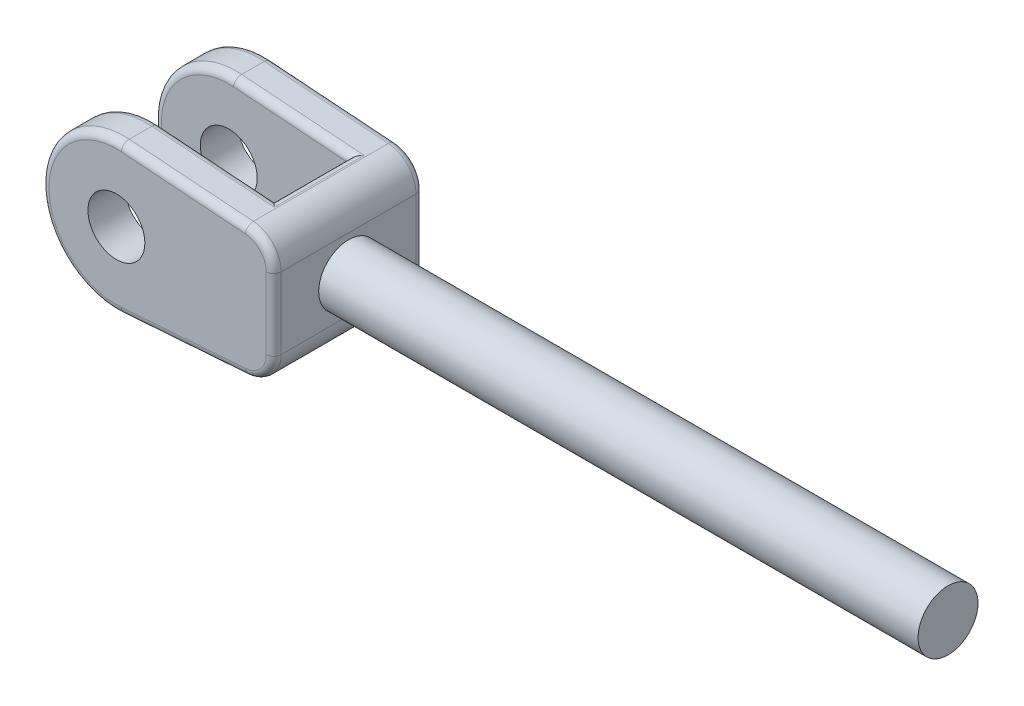
ISO-10303-21;
HEADER;
FILE_DESCRIPTION(('STEP AP214'),'2;1');
FILE_NAME('part.step','',(''),(''),'','','');
FILE_SCHEMA(('AUTOMOTIVE_DESIGN { 1 0 10303 214 1 1 1 1 }'));
ENDSEC;
DATA;
#1=APPLICATION_CONTEXT('core data for automotive mechanical design processes');
#2=APPLICATION_PROTOCOL_DEFINITION('international standard','automotive_design',2000,#1);
#3=PRODUCT_CONTEXT('',#1,'mechanical');
#4=PRODUCT('Part','Part','',(#3));
#5=PRODUCT_RELATED_PRODUCT_CATEGORY('part','',(#4));
#6=PRODUCT_DEFINITION_FORMATION('','',#4);
#7=PRODUCT_DEFINITION_CONTEXT('part definition',#1,'design');
#8=PRODUCT_DEFINITION('design','',#6,#7);
#9=PRODUCT_DEFINITION_SHAPE('','',#8);
#10=(LENGTH_UNIT() NAMED_UNIT(*) SI_UNIT(.MILLI.,.METRE.));
#11=(NAMED_UNIT(*) PLANE_ANGLE_UNIT() SI_UNIT($,.RADIAN.));
#12=(NAMED_UNIT(*) SI_UNIT($,.STERADIAN.) SOLID_ANGLE_UNIT());
#13=UNCERTAINTY_MEASURE_WITH_UNIT(LENGTH_MEASURE(1.E-05),#10,'distance_accuracy_value','');
#14=(GEOMETRIC_REPRESENTATION_CONTEXT(3) GLOBAL_UNCERTAINTY_ASSIGNED_CONTEXT((#13)) GLOBAL_UNIT_ASSIGNED_CONTEXT((#10,
#11,#12)) REPRESENTATION_CONTEXT('',''));
#15=CARTESIAN_POINT('',(0.,0.,0.));
#16=DIRECTION('',(0.,0.,1.));
#17=DIRECTION('',(1.,0.,0.));
#18=AXIS2_PLACEMENT_3D('',#15,#16,#17);
#19=CARTESIAN_POINT('',(-5.25,0.,2.5));
#20=DIRECTION('',(0.,0.,-1.));
#21=DIRECTION('',(-1.,0.,0.));
#22=AXIS2_PLACEMENT_3D('',#19,#20,#21);
#23=CYLINDRICAL_SURFACE('',#22,2.5);
#24=DIRECTION('',(0.,0.,-1.));
#25=VECTOR('',#24,1.);
#26=CARTESIAN_POINT('',(-5.06876612994241,2.49342220338713,2.5));
#27=LINE('',#26,#25);
#28=CARTESIAN_POINT('',(-5.06876612994241,2.49342220338713,2.25));
#29=VERTEX_POINT('',#28);
#30=CARTESIAN_POINT('',(-5.06876612994241,2.49342220338713,1.5));
#31=VERTEX_POINT('',#30);
#32=EDGE_CURVE('E195',#29,#31,#27,.T.);
#33=ORIENTED_EDGE('',*,*,#32,.T.);
#34=CARTESIAN_POINT('',(-5.25,0.,1.5));
#35=DIRECTION('',(0.,0.,1.));
#36=DIRECTION('',(1.,0.,0.));
#37=AXIS2_PLACEMENT_3D('',#34,#35,#36);
#38=CIRCLE('',#37,2.5);
#39=CARTESIAN_POINT('',(-5.06876612994241,-2.49342220338713,1.5));
#40=VERTEX_POINT('',#39);
#41=EDGE_CURVE('E338',#31,#40,#38,.T.);
#42=ORIENTED_EDGE('',*,*,#41,.T.);
#43=DIRECTION('',(0.,0.,-1.));
#44=VECTOR('',#43,1.);
#45=CARTESIAN_POINT('',(-5.06876612994241,-2.49342220338713,2.5));
#46=LINE('',#45,#44);
#47=CARTESIAN_POINT('',(-5.06876612994241,-2.49342220338713,2.25));
#48=VERTEX_POINT('',#47);
#49=EDGE_CURVE('E378',#48,#40,#46,.T.);
#50=ORIENTED_EDGE('',*,*,#49,.F.);
#51=CARTESIAN_POINT('',(-5.25,0.,2.25));
#52=DIRECTION('',(0.,0.,1.));
#53=DIRECTION('',(1.,0.,0.));
#54=AXIS2_PLACEMENT_3D('',#51,#52,#53);
#55=CIRCLE('',#54,2.5);
#56=EDGE_CURVE('E340',#48,#29,#55,.F.);
#57=ORIENTED_EDGE('',*,*,#56,.T.);
#58=EDGE_LOOP('',(#33,#42,#50,#57));
#59=FACE_BOUND('',#58,.T.);
#60=ADVANCED_FACE('F35',(#59),#23,.T.);
#61=CARTESIAN_POINT('',(-5.25,0.,2.5));
#62=DIRECTION('',(0.,0.,-1.));
#63=DIRECTION('',(-1.,0.,0.));
#64=AXIS2_PLACEMENT_3D('',#61,#62,#63);
#65=CYLINDRICAL_SURFACE('',#64,0.95);
#66=CARTESIAN_POINT('',(-5.25,0.,-1.25));
#67=DIRECTION('',(0.,0.,-1.));
#68=DIRECTION('',(-1.,0.,0.));
#69=AXIS2_PLACEMENT_3D('',#66,#67,#68);
#70=CIRCLE('',#69,0.95);
#71=CARTESIAN_POINT('',(-6.2,0.,-1.25));
#72=VERTEX_POINT('',#71);
#73=EDGE_CURVE('E360',#72,#72,#70,.T.);
#74=ORIENTED_EDGE('',*,*,#73,.F.);
#75=EDGE_LOOP('',(#74));
#76=FACE_BOUND('',#75,.T.);
#77=CARTESIAN_POINT('',(-5.25,0.,-2.5));
#78=DIRECTION('',(0.,0.,1.));
#79=DIRECTION('',(1.,0.,0.));
#80=AXIS2_PLACEMENT_3D('',#77,#78,#79);
#81=CIRCLE('',#80,0.95);
#82=CARTESIAN_POINT('',(-4.3,0.,-2.5));
#83=VERTEX_POINT('',#82);
#84=EDGE_CURVE('E363',#83,#83,#81,.T.);
#85=ORIENTED_EDGE('',*,*,#84,.F.);
#86=EDGE_LOOP('',(#85));
#87=FACE_BOUND('',#86,.T.);
#88=ADVANCED_FACE('F497',(#76,#87),#65,.F.);
#89=CARTESIAN_POINT('',(20.,0.,0.));
#90=DIRECTION('',(-1.,0.,0.));
#91=DIRECTION('',(0.,0.,1.));
#92=AXIS2_PLACEMENT_3D('',#89,#90,#91);
#93=CYLINDRICAL_SURFACE('',#92,1.);
#94=CARTESIAN_POINT('',(20.,0.,0.));
#95=DIRECTION('',(1.,0.,0.));
#96=DIRECTION('',(0.,0.,-1.));
#97=AXIS2_PLACEMENT_3D('',#94,#95,#96);
#98=CIRCLE('',#97,1.);
#99=CARTESIAN_POINT('',(20.,0.,-1.));
#100=VERTEX_POINT('',#99);
#101=EDGE_CURVE('E212',#100,#100,#98,.T.);
#102=ORIENTED_EDGE('',*,*,#101,.F.);
#103=EDGE_LOOP('',(#102));
#104=FACE_BOUND('',#103,.T.);
#105=CARTESIAN_POINT('',(0.,0.,0.));
#106=DIRECTION('',(-1.,0.,0.));
#107=DIRECTION('',(0.,-1.,0.));
#108=AXIS2_PLACEMENT_3D('',#105,#106,#107);
#109=CIRCLE('',#108,1.);
#110=CARTESIAN_POINT('',(0.,-1.,0.));
#111=VERTEX_POINT('',#110);
#112=EDGE_CURVE('E370',#111,#111,#109,.T.);
#113=ORIENTED_EDGE('',*,*,#112,.F.);
#114=EDGE_LOOP('',(#113));
#115=FACE_BOUND('',#114,.T.);
#116=ADVANCED_FACE('F503',(#104,#115),#93,.T.);
#117=CARTESIAN_POINT('',(20.,0.,0.));
#118=DIRECTION('',(1.,0.,0.));
#119=DIRECTION('',(0.,0.,-1.));
#120=AXIS2_PLACEMENT_3D('',#117,#118,#119);
#121=PLANE('',#120);
#122=ORIENTED_EDGE('',*,*,#101,.T.);
#123=EDGE_LOOP('',(#122));
#124=FACE_BOUND('',#123,.T.);
#125=ADVANCED_FACE('F765',(#124),#121,.T.);
#126=CARTESIAN_POINT('',(-5.25,0.,2.5));
#127=DIRECTION('',(0.,0.,1.));
#128=DIRECTION('',(1.,0.,0.));
#129=AXIS2_PLACEMENT_3D('',#126,#127,#128);
#130=PLANE('',#129);
#131=DIRECTION('',(-0.997368881354854,0.0724935480230351,0.));
#132=VECTOR('',#131,1.);
#133=CARTESIAN_POINT('',(-5.08688951694817,2.24407998304842,2.5));
#134=LINE('',#133,#132);
#135=CARTESIAN_POINT('',(-0.945629838982724,1.94307339165304,2.5));
#136=VERTEX_POINT('',#135);
#137=CARTESIAN_POINT('',(-5.08688951694817,2.24407998304842,2.5));
#138=VERTEX_POINT('',#137);
#139=EDGE_CURVE('E225',#136,#138,#134,.T.);
#140=ORIENTED_EDGE('',*,*,#139,.T.);
#141=CARTESIAN_POINT('',(-5.25,0.,2.5));
#142=DIRECTION('',(0.,0.,1.));
#143=DIRECTION('',(1.,0.,0.));
#144=AXIS2_PLACEMENT_3D('',#141,#142,#143);
#145=CIRCLE('',#144,2.25);
#146=CARTESIAN_POINT('',(-5.08688951694817,-2.24407998304842,2.5));
#147=VERTEX_POINT('',#146);
#148=EDGE_CURVE('E295',#138,#147,#145,.T.);
#149=ORIENTED_EDGE('',*,*,#148,.T.);
#150=DIRECTION('',(0.997368881354854,0.0724935480230352,0.));
#151=VECTOR('',#150,1.);
#152=CARTESIAN_POINT('',(-0.945629838982723,-1.94307339165304,2.5));
#153=LINE('',#152,#151);
#154=CARTESIAN_POINT('',(-0.945629838982724,-1.94307339165304,2.5));
#155=VERTEX_POINT('',#154);
#156=EDGE_CURVE('E305',#147,#155,#153,.T.);
#157=ORIENTED_EDGE('',*,*,#156,.T.);
#158=CARTESIAN_POINT('',(-1.,-1.1950467306369,2.5));
#159=DIRECTION('',(0.,0.,1.));
#160=DIRECTION('',(1.,0.,0.));
#161=AXIS2_PLACEMENT_3D('',#158,#159,#160);
#162=CIRCLE('',#161,0.75);
#163=CARTESIAN_POINT('',(-0.25,-1.1950467306369,2.5));
#164=VERTEX_POINT('',#163);
#165=EDGE_CURVE('E303',#155,#164,#162,.T.);
#166=ORIENTED_EDGE('',*,*,#165,.T.);
#167=DIRECTION('',(0.,1.,0.));
#168=VECTOR('',#167,1.);
#169=CARTESIAN_POINT('',(-0.25,1.1950467306369,2.5));
#170=LINE('',#169,#168);
#171=CARTESIAN_POINT('',(-0.25,1.1950467306369,2.5));
#172=VERTEX_POINT('',#171);
#173=EDGE_CURVE('E301',#164,#172,#170,.T.);
#174=ORIENTED_EDGE('',*,*,#173,.T.);
#175=CARTESIAN_POINT('',(-1.,1.1950467306369,2.5));
#176=DIRECTION('',(0.,0.,1.));
#177=DIRECTION('',(1.,0.,0.));
#178=AXIS2_PLACEMENT_3D('',#175,#176,#177);
#179=CIRCLE('',#178,0.75);
#180=EDGE_CURVE('E299',#172,#136,#179,.T.);
#181=ORIENTED_EDGE('',*,*,#180,.T.);
#182=EDGE_LOOP('',(#140,#149,#157,#166,#174,#181));
#183=FACE_BOUND('',#182,.T.);
#184=CARTESIAN_POINT('',(-5.25,0.,2.5));
#185=DIRECTION('',(0.,0.,1.));
#186=DIRECTION('',(1.,0.,0.));
#187=AXIS2_PLACEMENT_3D('',#184,#185,#186);
#188=CIRCLE('',#187,0.95);
#189=CARTESIAN_POINT('',(-4.3,0.,2.5));
#190=VERTEX_POINT('',#189);
#191=EDGE_CURVE('E379',#190,#190,#188,.T.);
#192=ORIENTED_EDGE('',*,*,#191,.F.);
#193=EDGE_LOOP('',(#192));
#194=FACE_BOUND('',#193,.T.);
#195=ADVANCED_FACE('F442',(#183,#194),#130,.T.);
#196=CARTESIAN_POINT('',(-5.25,0.,-2.5));
#197=DIRECTION('',(0.,0.,1.));
#198=DIRECTION('',(1.,0.,0.));
#199=AXIS2_PLACEMENT_3D('',#196,#197,#198);
#200=PLANE('',#199);
#201=DIRECTION('',(0.997368881354854,0.0724935480230352,0.));
#202=VECTOR('',#201,1.);
#203=CARTESIAN_POINT('',(-5.08688951694817,-2.24407998304842,-2.5));
#204=LINE('',#203,#202);
#205=CARTESIAN_POINT('',(-0.945629838982724,-1.94307339165304,-2.5));
#206=VERTEX_POINT('',#205);
#207=CARTESIAN_POINT('',(-5.08688951694817,-2.24407998304842,-2.5));
#208=VERTEX_POINT('',#207);
#209=EDGE_CURVE('E331',#206,#208,#204,.F.);
#210=ORIENTED_EDGE('',*,*,#209,.T.);
#211=CARTESIAN_POINT('',(-5.25,0.,-2.5));
#212=DIRECTION('',(0.,0.,1.));
#213=DIRECTION('',(1.,0.,0.));
#214=AXIS2_PLACEMENT_3D('',#211,#212,#213);
#215=CIRCLE('',#214,2.25);
#216=CARTESIAN_POINT('',(-5.08688951694817,2.24407998304842,-2.5));
#217=VERTEX_POINT('',#216);
#218=EDGE_CURVE('E222',#208,#217,#215,.F.);
#219=ORIENTED_EDGE('',*,*,#218,.T.);
#220=DIRECTION('',(-0.997368881354854,0.0724935480230351,0.));
#221=VECTOR('',#220,1.);
#222=CARTESIAN_POINT('',(-5.08688951694817,2.24407998304842,-2.5));
#223=LINE('',#222,#221);
#224=CARTESIAN_POINT('',(-0.945629838982724,1.94307339165304,-2.5));
#225=VERTEX_POINT('',#224);
#226=EDGE_CURVE('E323',#217,#225,#223,.F.);
#227=ORIENTED_EDGE('',*,*,#226,.T.);
#228=CARTESIAN_POINT('',(-1.,1.1950467306369,-2.5));
#229=DIRECTION('',(0.,0.,1.));
#230=DIRECTION('',(1.,0.,0.));
#231=AXIS2_PLACEMENT_3D('',#228,#229,#230);
#232=CIRCLE('',#231,0.75);
#233=CARTESIAN_POINT('',(-0.25,1.1950467306369,-2.5));
#234=VERTEX_POINT('',#233);
#235=EDGE_CURVE('E325',#225,#234,#232,.F.);
#236=ORIENTED_EDGE('',*,*,#235,.T.);
#237=DIRECTION('',(0.,1.,0.));
#238=VECTOR('',#237,1.);
#239=CARTESIAN_POINT('',(-0.25,0.,-2.5));
#240=LINE('',#239,#238);
#241=CARTESIAN_POINT('',(-0.25,-1.1950467306369,-2.5));
#242=VERTEX_POINT('',#241);
#243=EDGE_CURVE('E327',#234,#242,#240,.F.);
#244=ORIENTED_EDGE('',*,*,#243,.T.);
#245=CARTESIAN_POINT('',(-1.,-1.1950467306369,-2.5));
#246=DIRECTION('',(0.,0.,1.));
#247=DIRECTION('',(1.,0.,0.));
#248=AXIS2_PLACEMENT_3D('',#245,#246,#247);
#249=CIRCLE('',#248,0.75);
#250=EDGE_CURVE('E329',#242,#206,#249,.F.);
#251=ORIENTED_EDGE('',*,*,#250,.T.);
#252=EDGE_LOOP('',(#210,#219,#227,#236,#244,#251));
#253=FACE_BOUND('',#252,.T.);
#254=ORIENTED_EDGE('',*,*,#84,.T.);
#255=EDGE_LOOP('',(#254));
#256=FACE_BOUND('',#255,.T.);
#257=ADVANCED_FACE('F469',(#253,#256),#200,.F.);
#258=CARTESIAN_POINT('',(0.,-2.125,2.5));
#259=DIRECTION('',(-0.0724935480230352,0.997368881354854,0.));
#260=DIRECTION('',(-0.997368881354854,-0.0724935480230352,0.));
#261=AXIS2_PLACEMENT_3D('',#258,#259,#260);
#262=PLANE('',#261);
#263=CARTESIAN_POINT('',(-5.06876612994241,-2.49342220338713,-1.5));
#264=VERTEX_POINT('',#263);
#265=CARTESIAN_POINT('',(-5.06876612994241,-2.49342220338713,-2.25));
#266=VERTEX_POINT('',#265);
#267=EDGE_CURVE('E375',#264,#266,#46,.T.);
#268=ORIENTED_EDGE('',*,*,#267,.T.);
#269=DIRECTION('',(0.997368881354854,0.0724935480230352,0.));
#270=VECTOR('',#269,1.);
#271=CARTESIAN_POINT('',(0.,-2.125,-2.25));
#272=LINE('',#271,#270);
#273=CARTESIAN_POINT('',(-0.927506451976965,-2.19241561199175,-2.25));
#274=VERTEX_POINT('',#273);
#275=EDGE_CURVE('E285',#266,#274,#272,.T.);
#276=ORIENTED_EDGE('',*,*,#275,.T.);
#277=DIRECTION('',(0.,0.,-1.));
#278=VECTOR('',#277,1.);
#279=CARTESIAN_POINT('',(-0.927506451976965,-2.19241561199175,2.5));
#280=LINE('',#279,#278);
#281=CARTESIAN_POINT('',(-0.927506451976965,-2.19241561199175,2.25));
#282=VERTEX_POINT('',#281);
#283=EDGE_CURVE('E353',#274,#282,#280,.F.);
#284=ORIENTED_EDGE('',*,*,#283,.T.);
#285=DIRECTION('',(0.997368881354854,0.0724935480230352,0.));
#286=VECTOR('',#285,1.);
#287=CARTESIAN_POINT('',(-5.06876612994241,-2.49342220338713,2.25));
#288=LINE('',#287,#286);
#289=EDGE_CURVE('E293',#282,#48,#288,.F.);
#290=ORIENTED_EDGE('',*,*,#289,.T.);
#291=ORIENTED_EDGE('',*,*,#49,.T.);
#292=DIRECTION('',(0.997368881354854,0.0724935480230352,0.));
#293=VECTOR('',#292,1.);
#294=CARTESIAN_POINT('',(0.,-2.125,1.5));
#295=LINE('',#294,#293);
#296=CARTESIAN_POINT('',(-0.981876612994242,-2.19636749574551,1.5));
#297=VERTEX_POINT('',#296);
#298=EDGE_CURVE('E287',#40,#297,#295,.T.);
#299=ORIENTED_EDGE('',*,*,#298,.T.);
#300=DIRECTION('',(0.,0.,-1.));
#301=VECTOR('',#300,1.);
#302=CARTESIAN_POINT('',(-0.981876612994242,-2.19636749574551,2.5));
#303=LINE('',#302,#301);
#304=CARTESIAN_POINT('',(-0.981876612994242,-2.19636749574551,-1.5));
#305=VERTEX_POINT('',#304);
#306=EDGE_CURVE('E289',#297,#305,#303,.T.);
#307=ORIENTED_EDGE('',*,*,#306,.T.);
#308=DIRECTION('',(-0.997368881354854,-0.0724935480230352,0.));
#309=VECTOR('',#308,1.);
#310=CARTESIAN_POINT('',(0.,-2.125,-1.5));
#311=LINE('',#310,#309);
#312=EDGE_CURVE('E291',#305,#264,#311,.T.);
#313=ORIENTED_EDGE('',*,*,#312,.T.);
#314=EDGE_LOOP('',(#268,#276,#284,#290,#291,#299,#307,#313));
#315=FACE_BOUND('',#314,.T.);
#316=ADVANCED_FACE('F521',(#315),#262,.F.);
#317=CARTESIAN_POINT('',(0.,-2.125,2.5));
#318=DIRECTION('',(-1.,0.,0.));
#319=DIRECTION('',(0.,-1.,0.));
#320=AXIS2_PLACEMENT_3D('',#317,#318,#319);
#321=PLANE('',#320);
#322=ORIENTED_EDGE('',*,*,#112,.T.);
#323=EDGE_LOOP('',(#322));
#324=FACE_BOUND('',#323,.T.);
#325=DIRECTION('',(0.,0.,-1.));
#326=VECTOR('',#325,1.);
#327=CARTESIAN_POINT('',(0.,-1.1950467306369,2.5));
#328=LINE('',#327,#326);
#329=CARTESIAN_POINT('',(0.,-1.1950467306369,2.25));
#330=VERTEX_POINT('',#329);
#331=CARTESIAN_POINT('',(0.,-1.1950467306369,-2.25));
#332=VERTEX_POINT('',#331);
#333=EDGE_CURVE('E211',#330,#332,#328,.T.);
#334=ORIENTED_EDGE('',*,*,#333,.T.);
#335=DIRECTION('',(0.,1.,0.));
#336=VECTOR('',#335,1.);
#337=CARTESIAN_POINT('',(0.,-2.125,-2.25));
#338=LINE('',#337,#336);
#339=CARTESIAN_POINT('',(0.,1.1950467306369,-2.25));
#340=VERTEX_POINT('',#339);
#341=EDGE_CURVE('E316',#332,#340,#338,.T.);
#342=ORIENTED_EDGE('',*,*,#341,.T.);
#343=DIRECTION('',(0.,0.,-1.));
#344=VECTOR('',#343,1.);
#345=CARTESIAN_POINT('',(0.,1.1950467306369,2.5));
#346=LINE('',#345,#344);
#347=CARTESIAN_POINT('',(0.,1.1950467306369,2.25));
#348=VERTEX_POINT('',#347);
#349=EDGE_CURVE('E356',#340,#348,#346,.F.);
#350=ORIENTED_EDGE('',*,*,#349,.T.);
#351=DIRECTION('',(0.,1.,0.));
#352=VECTOR('',#351,1.);
#353=CARTESIAN_POINT('',(0.,-1.1950467306369,2.25));
#354=LINE('',#353,#352);
#355=EDGE_CURVE('E318',#348,#330,#354,.F.);
#356=ORIENTED_EDGE('',*,*,#355,.T.);
#357=EDGE_LOOP('',(#334,#342,#350,#356));
#358=FACE_BOUND('',#357,.T.);
#359=ADVANCED_FACE('F451',(#324,#358),#321,.F.);
#360=CARTESIAN_POINT('',(0.,2.125,2.5));
#361=DIRECTION('',(-0.0724935480230351,-0.997368881354854,0.));
#362=DIRECTION('',(0.997368881354854,-0.0724935480230351,0.));
#363=AXIS2_PLACEMENT_3D('',#360,#361,#362);
#364=PLANE('',#363);
#365=DIRECTION('',(0.,0.,-1.));
#366=VECTOR('',#365,1.);
#367=CARTESIAN_POINT('',(-0.927506451976965,2.19241561199175,2.5));
#368=LINE('',#367,#366);
#369=CARTESIAN_POINT('',(-0.927506451976965,2.19241561199175,2.25));
#370=VERTEX_POINT('',#369);
#371=CARTESIAN_POINT('',(-0.927506451976965,2.19241561199175,-2.25));
#372=VERTEX_POINT('',#371);
#373=EDGE_CURVE('E191',#370,#372,#368,.T.);
#374=ORIENTED_EDGE('',*,*,#373,.T.);
#375=DIRECTION('',(-0.997368881354854,0.0724935480230351,0.));
#376=VECTOR('',#375,1.);
#377=CARTESIAN_POINT('',(0.,2.125,-2.25));
#378=LINE('',#377,#376);
#379=CARTESIAN_POINT('',(-5.06876612994241,2.49342220338713,-2.25));
#380=VERTEX_POINT('',#379);
#381=EDGE_CURVE('E200',#372,#380,#378,.T.);
#382=ORIENTED_EDGE('',*,*,#381,.T.);
#383=CARTESIAN_POINT('',(-5.06876612994241,2.49342220338713,-1.5));
#384=VERTEX_POINT('',#383);
#385=EDGE_CURVE('E374',#384,#380,#27,.T.);
#386=ORIENTED_EDGE('',*,*,#385,.F.);
#387=DIRECTION('',(0.997368881354854,-0.0724935480230351,0.));
#388=VECTOR('',#387,1.);
#389=CARTESIAN_POINT('',(0.,2.125,-1.5));
#390=LINE('',#389,#388);
#391=CARTESIAN_POINT('',(-0.981876612994242,2.19636749574551,-1.5));
#392=VERTEX_POINT('',#391);
#393=EDGE_CURVE('E349',#384,#392,#390,.T.);
#394=ORIENTED_EDGE('',*,*,#393,.T.);
#395=DIRECTION('',(0.,0.,1.));
#396=VECTOR('',#395,1.);
#397=CARTESIAN_POINT('',(-0.981876612994242,2.19636749574551,2.5));
#398=LINE('',#397,#396);
#399=CARTESIAN_POINT('',(-0.981876612994242,2.19636749574551,1.5));
#400=VERTEX_POINT('',#399);
#401=EDGE_CURVE('E351',#392,#400,#398,.T.);
#402=ORIENTED_EDGE('',*,*,#401,.T.);
#403=DIRECTION('',(-0.997368881354854,0.0724935480230351,0.));
#404=VECTOR('',#403,1.);
#405=CARTESIAN_POINT('',(0.,2.125,1.5));
#406=LINE('',#405,#404);
#407=EDGE_CURVE('E201',#400,#31,#406,.T.);
#408=ORIENTED_EDGE('',*,*,#407,.T.);
#409=ORIENTED_EDGE('',*,*,#32,.F.);
#410=DIRECTION('',(-0.997368881354854,0.0724935480230351,0.));
#411=VECTOR('',#410,1.);
#412=CARTESIAN_POINT('',(-0.927506451976965,2.19241561199175,2.25));
#413=LINE('',#412,#411);
#414=EDGE_CURVE('E188',#29,#370,#413,.F.);
#415=ORIENTED_EDGE('',*,*,#414,.T.);
#416=EDGE_LOOP('',(#374,#382,#386,#394,#402,#408,#409,#415));
#417=FACE_BOUND('',#416,.T.);
#418=ADVANCED_FACE('F190',(#417),#364,.F.);
#419=ORIENTED_EDGE('',*,*,#385,.T.);
#420=CARTESIAN_POINT('',(-5.25,0.,-2.25));
#421=DIRECTION('',(0.,0.,1.));
#422=DIRECTION('',(1.,0.,0.));
#423=AXIS2_PLACEMENT_3D('',#420,#421,#422);
#424=CIRCLE('',#423,2.5);
#425=EDGE_CURVE('E333',#380,#266,#424,.T.);
#426=ORIENTED_EDGE('',*,*,#425,.T.);
#427=ORIENTED_EDGE('',*,*,#267,.F.);
#428=CARTESIAN_POINT('',(-5.25,0.,-1.5));
#429=DIRECTION('',(0.,0.,-1.));
#430=DIRECTION('',(-1.,0.,0.));
#431=AXIS2_PLACEMENT_3D('',#428,#429,#430);
#432=CIRCLE('',#431,2.5);
#433=EDGE_CURVE('E336',#264,#384,#432,.T.);
#434=ORIENTED_EDGE('',*,*,#433,.T.);
#435=EDGE_LOOP('',(#419,#426,#427,#434));
#436=FACE_BOUND('',#435,.T.);
#437=ADVANCED_FACE('F499',(#436),#23,.T.);
#438=CARTESIAN_POINT('',(-5.25,0.,1.25));
#439=DIRECTION('',(0.,0.,1.));
#440=DIRECTION('',(1.,0.,0.));
#441=AXIS2_PLACEMENT_3D('',#438,#439,#440);
#442=CIRCLE('',#441,0.95);
#443=CARTESIAN_POINT('',(-4.3,0.,1.25));
#444=VERTEX_POINT('',#443);
#445=EDGE_CURVE('E364',#444,#444,#442,.T.);
#446=ORIENTED_EDGE('',*,*,#445,.F.);
#447=EDGE_LOOP('',(#446));
#448=FACE_BOUND('',#447,.T.);
#449=ORIENTED_EDGE('',*,*,#191,.T.);
#450=EDGE_LOOP('',(#449));
#451=FACE_BOUND('',#450,.T.);
#452=ADVANCED_FACE('F506',(#448,#451),#65,.F.);
#453=CARTESIAN_POINT('',(-1.25,-2.5,1.25));
#454=DIRECTION('',(1.,0.,0.));
#455=DIRECTION('',(0.,0.,-1.));
#456=AXIS2_PLACEMENT_3D('',#453,#454,#455);
#457=PLANE('',#456);
#458=DIRECTION('',(0.,1.,0.));
#459=VECTOR('',#458,1.);
#460=CARTESIAN_POINT('',(-1.25,-2.5,-1.25));
#461=LINE('',#460,#459);
#462=CARTESIAN_POINT('',(-1.25,-1.94702527540679,-1.25));
#463=VERTEX_POINT('',#462);
#464=CARTESIAN_POINT('',(-1.25,1.94702527540679,-1.25));
#465=VERTEX_POINT('',#464);
#466=EDGE_CURVE('E367',#463,#465,#461,.T.);
#467=ORIENTED_EDGE('',*,*,#466,.F.);
#468=DIRECTION('',(0.,0.,-1.));
#469=VECTOR('',#468,1.);
#470=CARTESIAN_POINT('',(-1.25,-1.94702527540679,1.25));
#471=LINE('',#470,#469);
#472=CARTESIAN_POINT('',(-1.25,-1.94702527540679,1.25));
#473=VERTEX_POINT('',#472);
#474=EDGE_CURVE('E281',#463,#473,#471,.F.);
#475=ORIENTED_EDGE('',*,*,#474,.T.);
#476=DIRECTION('',(0.,1.,0.));
#477=VECTOR('',#476,1.);
#478=CARTESIAN_POINT('',(-1.25,-2.5,1.25));
#479=LINE('',#478,#477);
#480=CARTESIAN_POINT('',(-1.25,1.94702527540679,1.25));
#481=VERTEX_POINT('',#480);
#482=EDGE_CURVE('E257',#473,#481,#479,.T.);
#483=ORIENTED_EDGE('',*,*,#482,.T.);
#484=DIRECTION('',(0.,0.,1.));
#485=VECTOR('',#484,1.);
#486=CARTESIAN_POINT('',(-1.25,1.94702527540679,1.25));
#487=LINE('',#486,#485);
#488=EDGE_CURVE('E283',#481,#465,#487,.F.);
#489=ORIENTED_EDGE('',*,*,#488,.T.);
#490=EDGE_LOOP('',(#467,#475,#483,#489));
#491=FACE_BOUND('',#490,.T.);
#492=ADVANCED_FACE('F418',(#491),#457,.F.);
#493=CARTESIAN_POINT('',(-1.25,-2.5,-1.25));
#494=DIRECTION('',(0.,0.,-1.));
#495=DIRECTION('',(-1.,0.,0.));
#496=AXIS2_PLACEMENT_3D('',#493,#494,#495);
#497=PLANE('',#496);
#498=ORIENTED_EDGE('',*,*,#73,.T.);
#499=EDGE_LOOP('',(#498));
#500=FACE_BOUND('',#499,.T.);
#501=ORIENTED_EDGE('',*,*,#466,.T.);
#502=CARTESIAN_POINT('',(-1.,1.94702527540679,-1.25));
#503=DIRECTION('',(0.,0.,-1.));
#504=DIRECTION('',(-1.,0.,0.));
#505=AXIS2_PLACEMENT_3D('',#502,#503,#504);
#506=CIRCLE('',#505,0.25);
#507=CARTESIAN_POINT('',(-1.24934222033871,1.96514866241255,-1.25));
#508=VERTEX_POINT('',#507);
#509=EDGE_CURVE('E11',#465,#508,#506,.T.);
#510=ORIENTED_EDGE('',*,*,#509,.T.);
#511=DIRECTION('',(0.997368881354854,-0.0724935480230351,0.));
#512=VECTOR('',#511,1.);
#513=CARTESIAN_POINT('',(-0.927153752725097,1.94173046119728,-1.25));
#514=LINE('',#513,#512);
#515=CARTESIAN_POINT('',(-5.08688951694817,2.24407998304842,-1.25));
#516=VERTEX_POINT('',#515);
#517=EDGE_CURVE('E307',#508,#516,#514,.F.);
#518=ORIENTED_EDGE('',*,*,#517,.T.);
#519=CARTESIAN_POINT('',(-5.25,0.,-1.25));
#520=DIRECTION('',(0.,0.,-1.));
#521=DIRECTION('',(-1.,0.,0.));
#522=AXIS2_PLACEMENT_3D('',#519,#520,#521);
#523=CIRCLE('',#522,2.25);
#524=CARTESIAN_POINT('',(-5.08688951694817,-2.24407998304842,-1.25));
#525=VERTEX_POINT('',#524);
#526=EDGE_CURVE('E309',#516,#525,#523,.F.);
#527=ORIENTED_EDGE('',*,*,#526,.T.);
#528=DIRECTION('',(-0.997368881354854,-0.0724935480230352,0.));
#529=VECTOR('',#528,1.);
#530=CARTESIAN_POINT('',(-1.28866779721099,-1.96800703372212,-1.25));
#531=LINE('',#530,#529);
#532=CARTESIAN_POINT('',(-1.24934222033871,-1.96514866241255,-1.25));
#533=VERTEX_POINT('',#532);
#534=EDGE_CURVE('E60',#525,#533,#531,.F.);
#535=ORIENTED_EDGE('',*,*,#534,.T.);
#536=CARTESIAN_POINT('',(-1.,-1.94702527540679,-1.25));
#537=DIRECTION('',(0.,0.,-1.));
#538=DIRECTION('',(-1.,0.,0.));
#539=AXIS2_PLACEMENT_3D('',#536,#537,#538);
#540=CIRCLE('',#539,0.25);
#541=EDGE_CURVE('E279',#533,#463,#540,.T.);
#542=ORIENTED_EDGE('',*,*,#541,.T.);
#543=EDGE_LOOP('',(#501,#510,#518,#527,#535,#542));
#544=FACE_BOUND('',#543,.T.);
#545=ADVANCED_FACE('F389',(#500,#544),#497,.F.);
#546=CARTESIAN_POINT('',(-1.25,-2.5,1.25));
#547=DIRECTION('',(0.,0.,1.));
#548=DIRECTION('',(1.,0.,0.));
#549=AXIS2_PLACEMENT_3D('',#546,#547,#548);
#550=PLANE('',#549);
#551=ORIENTED_EDGE('',*,*,#445,.T.);
#552=EDGE_LOOP('',(#551));
#553=FACE_BOUND('',#552,.T.);
#554=CARTESIAN_POINT('',(-5.25,0.,1.25));
#555=DIRECTION('',(0.,0.,1.));
#556=DIRECTION('',(1.,0.,0.));
#557=AXIS2_PLACEMENT_3D('',#554,#555,#556);
#558=CIRCLE('',#557,2.25);
#559=CARTESIAN_POINT('',(-5.08688951694817,-2.24407998304842,1.25));
#560=VERTEX_POINT('',#559);
#561=CARTESIAN_POINT('',(-5.08688951694817,2.24407998304842,1.25));
#562=VERTEX_POINT('',#561);
#563=EDGE_CURVE('E344',#560,#562,#558,.F.);
#564=ORIENTED_EDGE('',*,*,#563,.T.);
#565=DIRECTION('',(-0.997368881354854,0.0724935480230351,0.));
#566=VECTOR('',#565,1.);
#567=CARTESIAN_POINT('',(-0.927153752725097,1.94173046119728,1.25));
#568=LINE('',#567,#566);
#569=CARTESIAN_POINT('',(-1.24934222033871,1.96514866241255,1.25));
#570=VERTEX_POINT('',#569);
#571=EDGE_CURVE('E342',#562,#570,#568,.F.);
#572=ORIENTED_EDGE('',*,*,#571,.T.);
#573=CARTESIAN_POINT('',(-1.,1.94702527540679,1.25));
#574=DIRECTION('',(0.,0.,1.));
#575=DIRECTION('',(1.,0.,0.));
#576=AXIS2_PLACEMENT_3D('',#573,#574,#575);
#577=CIRCLE('',#576,0.25);
#578=EDGE_CURVE('E44',#570,#481,#577,.T.);
#579=ORIENTED_EDGE('',*,*,#578,.T.);
#580=ORIENTED_EDGE('',*,*,#482,.F.);
#581=CARTESIAN_POINT('',(-1.,-1.94702527540679,1.25));
#582=DIRECTION('',(0.,0.,1.));
#583=DIRECTION('',(1.,0.,0.));
#584=AXIS2_PLACEMENT_3D('',#581,#582,#583);
#585=CIRCLE('',#584,0.25);
#586=CARTESIAN_POINT('',(-1.24934222033871,-1.96514866241255,1.25));
#587=VERTEX_POINT('',#586);
#588=EDGE_CURVE('E277',#473,#587,#585,.T.);
#589=ORIENTED_EDGE('',*,*,#588,.T.);
#590=DIRECTION('',(0.997368881354854,0.0724935480230352,0.));
#591=VECTOR('',#590,1.);
#592=CARTESIAN_POINT('',(-1.28866779721099,-1.96800703372212,1.25));
#593=LINE('',#592,#591);
#594=EDGE_CURVE('E52',#587,#560,#593,.F.);
#595=ORIENTED_EDGE('',*,*,#594,.T.);
#596=EDGE_LOOP('',(#564,#572,#579,#580,#589,#595));
#597=FACE_BOUND('',#596,.T.);
#598=ADVANCED_FACE('F420',(#553,#597),#550,.F.);
#599=CARTESIAN_POINT('',(-1.,1.1950467306369,2.5));
#600=DIRECTION('',(0.,0.,-1.));
#601=DIRECTION('',(-1.,0.,0.));
#602=AXIS2_PLACEMENT_3D('',#599,#600,#601);
#603=CYLINDRICAL_SURFACE('',#602,1.);
#604=ORIENTED_EDGE('',*,*,#349,.F.);
#605=CARTESIAN_POINT('',(-1.,1.1950467306369,-2.25));
#606=DIRECTION('',(0.,0.,1.));
#607=DIRECTION('',(1.,0.,0.));
#608=AXIS2_PLACEMENT_3D('',#605,#606,#607);
#609=CIRCLE('',#608,1.);
#610=EDGE_CURVE('E210',#340,#372,#609,.T.);
#611=ORIENTED_EDGE('',*,*,#610,.T.);
#612=ORIENTED_EDGE('',*,*,#373,.F.);
#613=CARTESIAN_POINT('',(-1.,1.1950467306369,2.25));
#614=DIRECTION('',(0.,0.,1.));
#615=DIRECTION('',(1.,0.,0.));
#616=AXIS2_PLACEMENT_3D('',#613,#614,#615);
#617=CIRCLE('',#616,1.);
#618=EDGE_CURVE('E207',#370,#348,#617,.F.);
#619=ORIENTED_EDGE('',*,*,#618,.T.);
#620=EDGE_LOOP('',(#604,#611,#612,#619));
#621=FACE_BOUND('',#620,.T.);
#622=ADVANCED_FACE('F206',(#621),#603,.T.);
#623=CARTESIAN_POINT('',(-1.,-1.1950467306369,2.5));
#624=DIRECTION('',(0.,0.,-1.));
#625=DIRECTION('',(-1.,0.,0.));
#626=AXIS2_PLACEMENT_3D('',#623,#624,#625);
#627=CYLINDRICAL_SURFACE('',#626,1.);
#628=ORIENTED_EDGE('',*,*,#283,.F.);
#629=CARTESIAN_POINT('',(-1.,-1.1950467306369,-2.25));
#630=DIRECTION('',(0.,0.,1.));
#631=DIRECTION('',(1.,0.,0.));
#632=AXIS2_PLACEMENT_3D('',#629,#630,#631);
#633=CIRCLE('',#632,1.);
#634=EDGE_CURVE('E312',#274,#332,#633,.T.);
#635=ORIENTED_EDGE('',*,*,#634,.T.);
#636=ORIENTED_EDGE('',*,*,#333,.F.);
#637=CARTESIAN_POINT('',(-1.,-1.1950467306369,2.25));
#638=DIRECTION('',(0.,0.,1.));
#639=DIRECTION('',(1.,0.,0.));
#640=AXIS2_PLACEMENT_3D('',#637,#638,#639);
#641=CIRCLE('',#640,1.);
#642=EDGE_CURVE('E314',#330,#282,#641,.F.);
#643=ORIENTED_EDGE('',*,*,#642,.T.);
#644=EDGE_LOOP('',(#628,#635,#636,#643));
#645=FACE_BOUND('',#644,.T.);
#646=ADVANCED_FACE('F455',(#645),#627,.T.);
#647=CARTESIAN_POINT('',(-0.0181233870057588,-1.87565777966129,-1.5));
#648=DIRECTION('',(-0.997368881354854,-0.0724935480230352,0.));
#649=DIRECTION('',(0.0724935480230352,-0.997368881354854,0.));
#650=AXIS2_PLACEMENT_3D('',#647,#648,#649);
#651=CYLINDRICAL_SURFACE('',#650,0.25);
#652=CARTESIAN_POINT('',(-1.,-1.94702527540679,-1.5));
#653=DIRECTION('',(-0.705246299350458,-0.0512606793993609,-0.707106781186547));
#654=DIRECTION('',(0.705246299350458,0.0512606793993609,-0.707106781186547));
#655=AXIS2_PLACEMENT_3D('',#652,#653,#654);
#656=ELLIPSE('',#655,0.353553390593274,0.25);
#657=EDGE_CURVE('E258',#533,#305,#656,.F.);
#658=ORIENTED_EDGE('',*,*,#657,.F.);
#659=ORIENTED_EDGE('',*,*,#534,.F.);
#660=CARTESIAN_POINT('',(-5.08688951694817,-2.24407998304842,-1.5));
#661=DIRECTION('',(-0.997368881354853,-0.0724935480230365,0.));
#662=DIRECTION('',(0.0724935480230365,-0.997368881354854,0.));
#663=AXIS2_PLACEMENT_3D('',#660,#661,#662);
#664=CIRCLE('',#663,0.25);
#665=EDGE_CURVE('E254',#264,#525,#664,.T.);
#666=ORIENTED_EDGE('',*,*,#665,.F.);
#667=ORIENTED_EDGE('',*,*,#312,.F.);
#668=EDGE_LOOP('',(#658,#659,#666,#667));
#669=FACE_BOUND('',#668,.T.);
#670=ADVANCED_FACE('F411',(#669),#651,.T.);
#671=CARTESIAN_POINT('',(-5.25,0.,-1.5));
#672=DIRECTION('',(0.,0.,-1.));
#673=DIRECTION('',(-1.,0.,0.));
#674=AXIS2_PLACEMENT_3D('',#671,#672,#673);
#675=TOROIDAL_SURFACE('',#674,2.25,0.25);
#676=ORIENTED_EDGE('',*,*,#665,.T.);
#677=ORIENTED_EDGE('',*,*,#526,.F.);
#678=CARTESIAN_POINT('',(-5.08688951694817,2.24407998304842,-1.5));
#679=DIRECTION('',(0.997368881354853,-0.0724935480230365,0.));
#680=DIRECTION('',(0.0724935480230365,0.997368881354854,0.));
#681=AXIS2_PLACEMENT_3D('',#678,#679,#680);
#682=CIRCLE('',#681,0.25);
#683=EDGE_CURVE('E261',#384,#516,#682,.T.);
#684=ORIENTED_EDGE('',*,*,#683,.F.);
#685=ORIENTED_EDGE('',*,*,#433,.F.);
#686=EDGE_LOOP('',(#676,#677,#684,#685));
#687=FACE_BOUND('',#686,.T.);
#688=ADVANCED_FACE('F406',(#687),#675,.T.);
#689=CARTESIAN_POINT('',(-1.,-1.94702527540679,2.5));
#690=DIRECTION('',(0.,0.,-1.));
#691=DIRECTION('',(-1.,0.,0.));
#692=AXIS2_PLACEMENT_3D('',#689,#690,#691);
#693=CYLINDRICAL_SURFACE('',#692,0.25);
#694=ORIENTED_EDGE('',*,*,#657,.T.);
#695=ORIENTED_EDGE('',*,*,#306,.F.);
#696=CARTESIAN_POINT('',(-1.,-1.94702527540679,1.5));
#697=DIRECTION('',(0.705246299350458,0.0512606793993609,-0.707106781186547));
#698=DIRECTION('',(-0.705246299350458,-0.0512606793993609,-0.707106781186547));
#699=AXIS2_PLACEMENT_3D('',#696,#697,#698);
#700=ELLIPSE('',#699,0.353553390593274,0.25);
#701=EDGE_CURVE('E264',#587,#297,#700,.F.);
#702=ORIENTED_EDGE('',*,*,#701,.F.);
#703=ORIENTED_EDGE('',*,*,#588,.F.);
#704=ORIENTED_EDGE('',*,*,#474,.F.);
#705=ORIENTED_EDGE('',*,*,#541,.F.);
#706=EDGE_LOOP('',(#694,#695,#702,#703,#704,#705));
#707=FACE_BOUND('',#706,.T.);
#708=ADVANCED_FACE('F414',(#707),#693,.T.);
#709=CARTESIAN_POINT('',(-0.0181233870057593,1.87565777966129,-1.5));
#710=DIRECTION('',(0.997368881354854,-0.0724935480230351,0.));
#711=DIRECTION('',(0.0724935480230351,0.997368881354854,0.));
#712=AXIS2_PLACEMENT_3D('',#709,#710,#711);
#713=CYLINDRICAL_SURFACE('',#712,0.25);
#714=ORIENTED_EDGE('',*,*,#517,.F.);
#715=CARTESIAN_POINT('',(-1.,1.94702527540679,-1.5));
#716=DIRECTION('',(0.705246299350458,-0.0512606793993607,0.707106781186547));
#717=DIRECTION('',(0.705246299350458,-0.0512606793993607,-0.707106781186547));
#718=AXIS2_PLACEMENT_3D('',#715,#716,#717);
#719=ELLIPSE('',#718,0.353553390593274,0.25);
#720=EDGE_CURVE('E266',#392,#508,#719,.T.);
#721=ORIENTED_EDGE('',*,*,#720,.F.);
#722=ORIENTED_EDGE('',*,*,#393,.F.);
#723=ORIENTED_EDGE('',*,*,#683,.T.);
#724=EDGE_LOOP('',(#714,#721,#722,#723));
#725=FACE_BOUND('',#724,.T.);
#726=ADVANCED_FACE('F402',(#725),#713,.T.);
#727=CARTESIAN_POINT('',(-0.0181233870057588,-1.87565777966129,1.5));
#728=DIRECTION('',(0.997368881354854,0.0724935480230352,0.));
#729=DIRECTION('',(-0.0724935480230352,0.997368881354854,0.));
#730=AXIS2_PLACEMENT_3D('',#727,#728,#729);
#731=CYLINDRICAL_SURFACE('',#730,0.25);
#732=ORIENTED_EDGE('',*,*,#701,.T.);
#733=ORIENTED_EDGE('',*,*,#298,.F.);
#734=CARTESIAN_POINT('',(-5.08688951694817,-2.24407998304842,1.5));
#735=DIRECTION('',(-0.997368881354853,-0.0724935480230365,0.));
#736=DIRECTION('',(0.0724935480230365,-0.997368881354854,0.));
#737=AXIS2_PLACEMENT_3D('',#734,#735,#736);
#738=CIRCLE('',#737,0.25);
#739=EDGE_CURVE('E269',#560,#40,#738,.T.);
#740=ORIENTED_EDGE('',*,*,#739,.F.);
#741=ORIENTED_EDGE('',*,*,#594,.F.);
#742=EDGE_LOOP('',(#732,#733,#740,#741));
#743=FACE_BOUND('',#742,.T.);
#744=ADVANCED_FACE('F522',(#743),#731,.T.);
#745=CARTESIAN_POINT('',(-1.,1.94702527540679,2.5));
#746=DIRECTION('',(0.,0.,1.));
#747=DIRECTION('',(1.,0.,0.));
#748=AXIS2_PLACEMENT_3D('',#745,#746,#747);
#749=CYLINDRICAL_SURFACE('',#748,0.25);
#750=ORIENTED_EDGE('',*,*,#488,.F.);
#751=ORIENTED_EDGE('',*,*,#578,.F.);
#752=CARTESIAN_POINT('',(-1.,1.94702527540679,1.5));
#753=DIRECTION('',(-0.705246299350458,0.0512606793993607,0.707106781186547));
#754=DIRECTION('',(-0.705246299350458,0.0512606793993607,-0.707106781186547));
#755=AXIS2_PLACEMENT_3D('',#752,#753,#754);
#756=ELLIPSE('',#755,0.353553390593274,0.25);
#757=EDGE_CURVE('E272',#400,#570,#756,.T.);
#758=ORIENTED_EDGE('',*,*,#757,.F.);
#759=ORIENTED_EDGE('',*,*,#401,.F.);
#760=ORIENTED_EDGE('',*,*,#720,.T.);
#761=ORIENTED_EDGE('',*,*,#509,.F.);
#762=EDGE_LOOP('',(#750,#751,#758,#759,#760,#761));
#763=FACE_BOUND('',#762,.T.);
#764=ADVANCED_FACE('F395',(#763),#749,.T.);
#765=CARTESIAN_POINT('',(-5.25,0.,1.5));
#766=DIRECTION('',(0.,0.,1.));
#767=DIRECTION('',(1.,0.,0.));
#768=AXIS2_PLACEMENT_3D('',#765,#766,#767);
#769=TOROIDAL_SURFACE('',#768,2.25,0.25);
#770=ORIENTED_EDGE('',*,*,#739,.T.);
#771=ORIENTED_EDGE('',*,*,#41,.F.);
#772=CARTESIAN_POINT('',(-5.08688951694817,2.24407998304842,1.5));
#773=DIRECTION('',(0.997368881354853,-0.0724935480230365,0.));
#774=DIRECTION('',(0.0724935480230365,0.997368881354854,0.));
#775=AXIS2_PLACEMENT_3D('',#772,#773,#774);
#776=CIRCLE('',#775,0.25);
#777=EDGE_CURVE('E240',#562,#31,#776,.T.);
#778=ORIENTED_EDGE('',*,*,#777,.F.);
#779=ORIENTED_EDGE('',*,*,#563,.F.);
#780=EDGE_LOOP('',(#770,#771,#778,#779));
#781=FACE_BOUND('',#780,.T.);
#782=ADVANCED_FACE('F493',(#781),#769,.T.);
#783=CARTESIAN_POINT('',(-0.0181233870057593,1.87565777966129,1.5));
#784=DIRECTION('',(-0.997368881354854,0.0724935480230351,0.));
#785=DIRECTION('',(-0.0724935480230351,-0.997368881354854,0.));
#786=AXIS2_PLACEMENT_3D('',#783,#784,#785);
#787=CYLINDRICAL_SURFACE('',#786,0.25);
#788=ORIENTED_EDGE('',*,*,#757,.T.);
#789=ORIENTED_EDGE('',*,*,#571,.F.);
#790=ORIENTED_EDGE('',*,*,#777,.T.);
#791=ORIENTED_EDGE('',*,*,#407,.F.);
#792=EDGE_LOOP('',(#788,#789,#790,#791));
#793=FACE_BOUND('',#792,.T.);
#794=ADVANCED_FACE('F424',(#793),#787,.T.);
#795=CARTESIAN_POINT('',(-0.25,-2.125,-2.25));
#796=DIRECTION('',(0.,1.,0.));
#797=DIRECTION('',(-1.,0.,0.));
#798=AXIS2_PLACEMENT_3D('',#795,#796,#797);
#799=CYLINDRICAL_SURFACE('',#798,0.25);
#800=CARTESIAN_POINT('',(-0.25,-1.1950467306369,-2.25));
#801=DIRECTION('',(0.,-1.,0.));
#802=DIRECTION('',(0.,0.,-1.));
#803=AXIS2_PLACEMENT_3D('',#800,#801,#802);
#804=CIRCLE('',#803,0.25);
#805=EDGE_CURVE('E241',#242,#332,#804,.T.);
#806=ORIENTED_EDGE('',*,*,#805,.F.);
#807=ORIENTED_EDGE('',*,*,#243,.F.);
#808=CARTESIAN_POINT('',(-0.25,1.1950467306369,-2.25));
#809=DIRECTION('',(0.,1.,0.));
#810=DIRECTION('',(0.,0.,1.));
#811=AXIS2_PLACEMENT_3D('',#808,#809,#810);
#812=CIRCLE('',#811,0.25);
#813=EDGE_CURVE('E237',#340,#234,#812,.T.);
#814=ORIENTED_EDGE('',*,*,#813,.F.);
#815=ORIENTED_EDGE('',*,*,#341,.F.);
#816=EDGE_LOOP('',(#806,#807,#814,#815));
#817=FACE_BOUND('',#816,.T.);
#818=ADVANCED_FACE('F485',(#817),#799,.T.);
#819=CARTESIAN_POINT('',(-1.,1.1950467306369,-2.25));
#820=DIRECTION('',(0.,0.,1.));
#821=DIRECTION('',(1.,0.,0.));
#822=AXIS2_PLACEMENT_3D('',#819,#820,#821);
#823=TOROIDAL_SURFACE('',#822,0.75,0.25);
#824=ORIENTED_EDGE('',*,*,#813,.T.);
#825=ORIENTED_EDGE('',*,*,#235,.F.);
#826=CARTESIAN_POINT('',(-0.945629838982724,1.94307339165304,-2.25));
#827=DIRECTION('',(-0.997368881354854,0.0724935480230352,0.));
#828=DIRECTION('',(-0.0724935480230352,-0.997368881354854,0.));
#829=AXIS2_PLACEMENT_3D('',#826,#827,#828);
#830=CIRCLE('',#829,0.25);
#831=EDGE_CURVE('E244',#372,#225,#830,.T.);
#832=ORIENTED_EDGE('',*,*,#831,.F.);
#833=ORIENTED_EDGE('',*,*,#610,.F.);
#834=EDGE_LOOP('',(#824,#825,#832,#833));
#835=FACE_BOUND('',#834,.T.);
#836=ADVANCED_FACE('F482',(#835),#823,.T.);
#837=CARTESIAN_POINT('',(-1.,-1.1950467306369,-2.25));
#838=DIRECTION('',(0.,0.,1.));
#839=DIRECTION('',(1.,0.,0.));
#840=AXIS2_PLACEMENT_3D('',#837,#838,#839);
#841=TOROIDAL_SURFACE('',#840,0.75,0.25);
#842=ORIENTED_EDGE('',*,*,#805,.T.);
#843=ORIENTED_EDGE('',*,*,#634,.F.);
#844=CARTESIAN_POINT('',(-0.945629838982724,-1.94307339165304,-2.25));
#845=DIRECTION('',(-0.997368881354853,-0.0724935480230353,0.));
#846=DIRECTION('',(0.0724935480230353,-0.997368881354854,0.));
#847=AXIS2_PLACEMENT_3D('',#844,#845,#846);
#848=CIRCLE('',#847,0.25);
#849=EDGE_CURVE('E247',#206,#274,#848,.T.);
#850=ORIENTED_EDGE('',*,*,#849,.F.);
#851=ORIENTED_EDGE('',*,*,#250,.F.);
#852=EDGE_LOOP('',(#842,#843,#850,#851));
#853=FACE_BOUND('',#852,.T.);
#854=ADVANCED_FACE('F459',(#853),#841,.T.);
#855=CARTESIAN_POINT('',(-0.0181233870057593,1.87565777966129,-2.25));
#856=DIRECTION('',(-0.997368881354854,0.0724935480230351,0.));
#857=DIRECTION('',(-0.0724935480230351,-0.997368881354854,0.));
#858=AXIS2_PLACEMENT_3D('',#855,#856,#857);
#859=CYLINDRICAL_SURFACE('',#858,0.25);
#860=ORIENTED_EDGE('',*,*,#831,.T.);
#861=ORIENTED_EDGE('',*,*,#226,.F.);
#862=CARTESIAN_POINT('',(-5.08688951694817,2.24407998304842,-2.25));
#863=DIRECTION('',(-0.997368881354853,0.0724935480230365,0.));
#864=DIRECTION('',(-0.0724935480230365,-0.997368881354854,0.));
#865=AXIS2_PLACEMENT_3D('',#862,#863,#864);
#866=CIRCLE('',#865,0.25);
#867=EDGE_CURVE('E250',#380,#217,#866,.T.);
#868=ORIENTED_EDGE('',*,*,#867,.F.);
#869=ORIENTED_EDGE('',*,*,#381,.F.);
#870=EDGE_LOOP('',(#860,#861,#868,#869));
#871=FACE_BOUND('',#870,.T.);
#872=ADVANCED_FACE('F478',(#871),#859,.T.);
#873=CARTESIAN_POINT('',(-0.0181233870057588,-1.87565777966129,-2.25));
#874=DIRECTION('',(0.997368881354854,0.0724935480230352,0.));
#875=DIRECTION('',(-0.0724935480230352,0.997368881354854,0.));
#876=AXIS2_PLACEMENT_3D('',#873,#874,#875);
#877=CYLINDRICAL_SURFACE('',#876,0.25);
#878=ORIENTED_EDGE('',*,*,#849,.T.);
#879=ORIENTED_EDGE('',*,*,#275,.F.);
#880=CARTESIAN_POINT('',(-5.08688951694817,-2.24407998304842,-2.25));
#881=DIRECTION('',(-0.997368881354853,-0.0724935480230365,0.));
#882=DIRECTION('',(0.0724935480230365,-0.997368881354854,0.));
#883=AXIS2_PLACEMENT_3D('',#880,#881,#882);
#884=CIRCLE('',#883,0.25);
#885=EDGE_CURVE('E252',#208,#266,#884,.T.);
#886=ORIENTED_EDGE('',*,*,#885,.F.);
#887=ORIENTED_EDGE('',*,*,#209,.F.);
#888=EDGE_LOOP('',(#878,#879,#886,#887));
#889=FACE_BOUND('',#888,.T.);
#890=ADVANCED_FACE('F465',(#889),#877,.T.);
#891=CARTESIAN_POINT('',(-5.25,0.,-2.25));
#892=DIRECTION('',(0.,0.,1.));
#893=DIRECTION('',(1.,0.,0.));
#894=AXIS2_PLACEMENT_3D('',#891,#892,#893);
#895=TOROIDAL_SURFACE('',#894,2.25,0.25);
#896=ORIENTED_EDGE('',*,*,#867,.T.);
#897=ORIENTED_EDGE('',*,*,#218,.F.);
#898=ORIENTED_EDGE('',*,*,#885,.T.);
#899=ORIENTED_EDGE('',*,*,#425,.F.);
#900=EDGE_LOOP('',(#896,#897,#898,#899));
#901=FACE_BOUND('',#900,.T.);
#902=ADVANCED_FACE('F472',(#901),#895,.T.);
#903=CARTESIAN_POINT('',(-0.25,0.,2.25));
#904=DIRECTION('',(0.,-1.,0.));
#905=DIRECTION('',(1.,0.,0.));
#906=AXIS2_PLACEMENT_3D('',#903,#904,#905);
#907=CYLINDRICAL_SURFACE('',#906,0.25);
#908=CARTESIAN_POINT('',(-0.25,-1.1950467306369,2.25));
#909=DIRECTION('',(0.,-1.,0.));
#910=DIRECTION('',(0.,0.,-1.));
#911=AXIS2_PLACEMENT_3D('',#908,#909,#910);
#912=CIRCLE('',#911,0.25);
#913=EDGE_CURVE('E226',#330,#164,#912,.T.);
#914=ORIENTED_EDGE('',*,*,#913,.F.);
#915=ORIENTED_EDGE('',*,*,#355,.F.);
#916=CARTESIAN_POINT('',(-0.25,1.1950467306369,2.25));
#917=DIRECTION('',(0.,1.,0.));
#918=DIRECTION('',(0.,0.,1.));
#919=AXIS2_PLACEMENT_3D('',#916,#917,#918);
#920=CIRCLE('',#919,0.25);
#921=EDGE_CURVE('E39',#172,#348,#920,.T.);
#922=ORIENTED_EDGE('',*,*,#921,.F.);
#923=ORIENTED_EDGE('',*,*,#173,.F.);
#924=EDGE_LOOP('',(#914,#915,#922,#923));
#925=FACE_BOUND('',#924,.T.);
#926=ADVANCED_FACE('F37',(#925),#907,.T.);
#927=CARTESIAN_POINT('',(-1.,1.1950467306369,2.25));
#928=DIRECTION('',(0.,0.,1.));
#929=DIRECTION('',(1.,0.,0.));
#930=AXIS2_PLACEMENT_3D('',#927,#928,#929);
#931=TOROIDAL_SURFACE('',#930,0.75,0.25);
#932=ORIENTED_EDGE('',*,*,#921,.T.);
#933=ORIENTED_EDGE('',*,*,#618,.F.);
#934=CARTESIAN_POINT('',(-0.945629838982724,1.94307339165304,2.25));
#935=DIRECTION('',(-0.997368881354854,0.0724935480230352,0.));
#936=DIRECTION('',(-0.0724935480230352,-0.997368881354854,0.));
#937=AXIS2_PLACEMENT_3D('',#934,#935,#936);
#938=CIRCLE('',#937,0.25);
#939=EDGE_CURVE('E219',#136,#370,#938,.T.);
#940=ORIENTED_EDGE('',*,*,#939,.F.);
#941=ORIENTED_EDGE('',*,*,#180,.F.);
#942=EDGE_LOOP('',(#932,#933,#940,#941));
#943=FACE_BOUND('',#942,.T.);
#944=ADVANCED_FACE('F217',(#943),#931,.T.);
#945=CARTESIAN_POINT('',(-1.,-1.1950467306369,2.25));
#946=DIRECTION('',(0.,0.,1.));
#947=DIRECTION('',(1.,0.,0.));
#948=AXIS2_PLACEMENT_3D('',#945,#946,#947);
#949=TOROIDAL_SURFACE('',#948,0.75,0.25);
#950=ORIENTED_EDGE('',*,*,#913,.T.);
#951=ORIENTED_EDGE('',*,*,#165,.F.);
#952=CARTESIAN_POINT('',(-0.945629838982724,-1.94307339165304,2.25));
#953=DIRECTION('',(-0.997368881354854,-0.0724935480230352,0.));
#954=DIRECTION('',(0.0724935480230352,-0.997368881354854,0.));
#955=AXIS2_PLACEMENT_3D('',#952,#953,#954);
#956=CIRCLE('',#955,0.25);
#957=EDGE_CURVE('E227',#282,#155,#956,.T.);
#958=ORIENTED_EDGE('',*,*,#957,.F.);
#959=ORIENTED_EDGE('',*,*,#642,.F.);
#960=EDGE_LOOP('',(#950,#951,#958,#959));
#961=FACE_BOUND('',#960,.T.);
#962=ADVANCED_FACE('F577',(#961),#949,.T.);
#963=CARTESIAN_POINT('',(-5.08688951694817,2.24407998304842,2.25));
#964=DIRECTION('',(0.997368881354854,-0.0724935480230351,0.));
#965=DIRECTION('',(0.0724935480230351,0.997368881354854,0.));
#966=AXIS2_PLACEMENT_3D('',#963,#964,#965);
#967=CYLINDRICAL_SURFACE('',#966,0.25);
#968=ORIENTED_EDGE('',*,*,#939,.T.);
#969=ORIENTED_EDGE('',*,*,#414,.F.);
#970=CARTESIAN_POINT('',(-5.08688951694817,2.24407998304842,2.25));
#971=DIRECTION('',(-0.997368881354853,0.0724935480230365,0.));
#972=DIRECTION('',(-0.0724935480230365,-0.997368881354854,0.));
#973=AXIS2_PLACEMENT_3D('',#970,#971,#972);
#974=CIRCLE('',#973,0.25);
#975=EDGE_CURVE('E231',#138,#29,#974,.T.);
#976=ORIENTED_EDGE('',*,*,#975,.F.);
#977=ORIENTED_EDGE('',*,*,#139,.F.);
#978=EDGE_LOOP('',(#968,#969,#976,#977));
#979=FACE_BOUND('',#978,.T.);
#980=ADVANCED_FACE('F224',(#979),#967,.T.);
#981=CARTESIAN_POINT('',(-5.08688951694817,-2.24407998304842,2.25));
#982=DIRECTION('',(-0.997368881354854,-0.0724935480230352,0.));
#983=DIRECTION('',(0.0724935480230352,-0.997368881354854,0.));
#984=AXIS2_PLACEMENT_3D('',#981,#982,#983);
#985=CYLINDRICAL_SURFACE('',#984,0.25);
#986=ORIENTED_EDGE('',*,*,#957,.T.);
#987=ORIENTED_EDGE('',*,*,#156,.F.);
#988=CARTESIAN_POINT('',(-5.08688951694817,-2.24407998304842,2.25));
#989=DIRECTION('',(-0.997368881354853,-0.0724935480230365,0.));
#990=DIRECTION('',(0.0724935480230365,-0.997368881354854,0.));
#991=AXIS2_PLACEMENT_3D('',#988,#989,#990);
#992=CIRCLE('',#991,0.25);
#993=EDGE_CURVE('E235',#48,#147,#992,.T.);
#994=ORIENTED_EDGE('',*,*,#993,.F.);
#995=ORIENTED_EDGE('',*,*,#289,.F.);
#996=EDGE_LOOP('',(#986,#987,#994,#995));
#997=FACE_BOUND('',#996,.T.);
#998=ADVANCED_FACE('F438',(#997),#985,.T.);
#999=CARTESIAN_POINT('',(-5.25,0.,2.25));
#1000=DIRECTION('',(0.,0.,1.));
#1001=DIRECTION('',(1.,0.,0.));
#1002=AXIS2_PLACEMENT_3D('',#999,#1000,#1001);
#1003=TOROIDAL_SURFACE('',#1002,2.25,0.25);
#1004=ORIENTED_EDGE('',*,*,#975,.T.);
#1005=ORIENTED_EDGE('',*,*,#56,.F.);
#1006=ORIENTED_EDGE('',*,*,#993,.T.);
#1007=ORIENTED_EDGE('',*,*,#148,.F.);
#1008=EDGE_LOOP('',(#1004,#1005,#1006,#1007));
#1009=FACE_BOUND('',#1008,.T.);
#1010=ADVANCED_FACE('F433',(#1009),#1003,.T.);
#1011=CLOSED_SHELL('',(#60,#88,#116,#125,#195,#257,#316,#359,#418,#437,#452,#492,#545,#598,#622,
#646,#670,#688,#708,#726,#744,#764,#782,#794,#818,#836,#854,#872,#890,#902,#926,#944,#962,#980,
#998,#1010));
#1012=MANIFOLD_SOLID_BREP('B2',#1011);
#1013=ADVANCED_BREP_SHAPE_REPRESENTATION('',(#18,#1012),#14);
#1014=SHAPE_DEFINITION_REPRESENTATION(#9,#1013);
ENDSEC;
END-ISO-10303-21;
